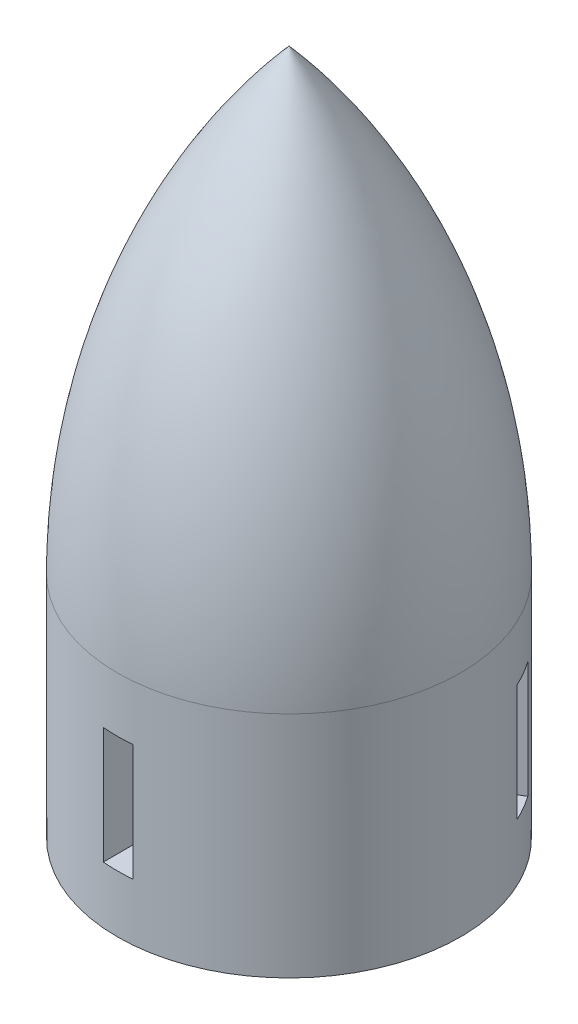
ISO-10303-21;
HEADER;
FILE_DESCRIPTION(('STEP AP214'),'2;1');
FILE_NAME('part.step','',(''),(''),'','','');
FILE_SCHEMA(('AUTOMOTIVE_DESIGN { 1 0 10303 214 1 1 1 1 }'));
ENDSEC;
DATA;
#1=APPLICATION_CONTEXT('core data for automotive mechanical design processes');
#2=APPLICATION_PROTOCOL_DEFINITION('international standard','automotive_design',2000,#1);
#3=PRODUCT_CONTEXT('',#1,'mechanical');
#4=PRODUCT('Part','Part','',(#3));
#5=PRODUCT_RELATED_PRODUCT_CATEGORY('part','',(#4));
#6=PRODUCT_DEFINITION_FORMATION('','',#4);
#7=PRODUCT_DEFINITION_CONTEXT('part definition',#1,'design');
#8=PRODUCT_DEFINITION('design','',#6,#7);
#9=PRODUCT_DEFINITION_SHAPE('','',#8);
#10=(LENGTH_UNIT() NAMED_UNIT(*) SI_UNIT(.MILLI.,.METRE.));
#11=(NAMED_UNIT(*) PLANE_ANGLE_UNIT() SI_UNIT($,.RADIAN.));
#12=(NAMED_UNIT(*) SI_UNIT($,.STERADIAN.) SOLID_ANGLE_UNIT());
#13=UNCERTAINTY_MEASURE_WITH_UNIT(LENGTH_MEASURE(1.E-05),#10,'distance_accuracy_value','');
#14=(GEOMETRIC_REPRESENTATION_CONTEXT(3) GLOBAL_UNCERTAINTY_ASSIGNED_CONTEXT((#13)) GLOBAL_UNIT_ASSIGNED_CONTEXT((#10,
#11,#12)) REPRESENTATION_CONTEXT('',''));
#15=CARTESIAN_POINT('',(0.,0.,0.));
#16=DIRECTION('',(0.,0.,1.));
#17=DIRECTION('',(1.,0.,0.));
#18=AXIS2_PLACEMENT_3D('',#15,#16,#17);
#19=CARTESIAN_POINT('',(0.,25.4,0.));
#20=DIRECTION('',(0.,-1.,0.));
#21=DIRECTION('',(0.,0.,-1.));
#22=AXIS2_PLACEMENT_3D('',#19,#20,#21);
#23=CYLINDRICAL_SURFACE('',#22,19.05);
#24=DIRECTION('',(0.,-1.,0.));
#25=VECTOR('',#24,1.);
#26=CARTESIAN_POINT('',(-17.2612088149553,25.4,-8.05935296698873));
#27=LINE('',#26,#25);
#28=CARTESIAN_POINT('',(-17.2612088149553,19.304,-8.05935296698873));
#29=VERTEX_POINT('',#28);
#30=CARTESIAN_POINT('',(-17.2612088149553,6.35,-8.05935296698873));
#31=VERTEX_POINT('',#30);
#32=EDGE_CURVE('E11',#29,#31,#27,.T.);
#33=ORIENTED_EDGE('',*,*,#32,.T.);
#34=CARTESIAN_POINT('',(0.,6.35,0.));
#35=DIRECTION('',(0.,-1.,0.));
#36=DIRECTION('',(0.,0.,-1.));
#37=AXIS2_PLACEMENT_3D('',#34,#35,#36);
#38=CIRCLE('',#37,19.05);
#39=CARTESIAN_POINT('',(-15.6102088149553,6.35,-10.9189688502849));
#40=VERTEX_POINT('',#39);
#41=EDGE_CURVE('E452',#31,#40,#38,.T.);
#42=ORIENTED_EDGE('',*,*,#41,.T.);
#43=DIRECTION('',(0.,-1.,0.));
#44=VECTOR('',#43,1.);
#45=CARTESIAN_POINT('',(-15.6102088149553,25.4,-10.9189688502849));
#46=LINE('',#45,#44);
#47=CARTESIAN_POINT('',(-15.6102088149553,19.304,-10.9189688502849));
#48=VERTEX_POINT('',#47);
#49=EDGE_CURVE('E40',#40,#48,#46,.F.);
#50=ORIENTED_EDGE('',*,*,#49,.T.);
#51=CARTESIAN_POINT('',(0.,19.304,0.));
#52=DIRECTION('',(0.,1.,0.));
#53=DIRECTION('',(0.,0.,1.));
#54=AXIS2_PLACEMENT_3D('',#51,#52,#53);
#55=CIRCLE('',#54,19.05);
#56=EDGE_CURVE('E454',#48,#29,#55,.T.);
#57=ORIENTED_EDGE('',*,*,#56,.T.);
#58=EDGE_LOOP('',(#33,#42,#50,#57));
#59=FACE_BOUND('',#58,.T.);
#60=DIRECTION('',(0.,-1.,0.));
#61=VECTOR('',#60,1.);
#62=CARTESIAN_POINT('',(15.6102088149554,25.4,-10.9189688502847));
#63=LINE('',#62,#61);
#64=CARTESIAN_POINT('',(15.6102088149554,19.304,-10.9189688502847));
#65=VERTEX_POINT('',#64);
#66=CARTESIAN_POINT('',(15.6102088149554,6.35,-10.9189688502847));
#67=VERTEX_POINT('',#66);
#68=EDGE_CURVE('E449',#65,#67,#63,.T.);
#69=ORIENTED_EDGE('',*,*,#68,.T.);
#70=CARTESIAN_POINT('',(0.,6.35,0.));
#71=DIRECTION('',(0.,-1.,0.));
#72=DIRECTION('',(0.,0.,-1.));
#73=AXIS2_PLACEMENT_3D('',#70,#71,#72);
#74=CIRCLE('',#73,19.05);
#75=CARTESIAN_POINT('',(17.2612088149554,6.35,-8.05935296698849));
#76=VERTEX_POINT('',#75);
#77=EDGE_CURVE('E440',#67,#76,#74,.T.);
#78=ORIENTED_EDGE('',*,*,#77,.T.);
#79=DIRECTION('',(0.,-1.,0.));
#80=VECTOR('',#79,1.);
#81=CARTESIAN_POINT('',(17.2612088149554,25.4,-8.05935296698849));
#82=LINE('',#81,#80);
#83=CARTESIAN_POINT('',(17.2612088149554,19.304,-8.05935296698849));
#84=VERTEX_POINT('',#83);
#85=EDGE_CURVE('E446',#76,#84,#82,.F.);
#86=ORIENTED_EDGE('',*,*,#85,.T.);
#87=CARTESIAN_POINT('',(0.,19.304,0.));
#88=DIRECTION('',(0.,1.,0.));
#89=DIRECTION('',(0.,0.,1.));
#90=AXIS2_PLACEMENT_3D('',#87,#88,#89);
#91=CIRCLE('',#90,19.05);
#92=EDGE_CURVE('E443',#84,#65,#91,.T.);
#93=ORIENTED_EDGE('',*,*,#92,.T.);
#94=EDGE_LOOP('',(#69,#78,#86,#93));
#95=FACE_BOUND('',#94,.T.);
#96=CARTESIAN_POINT('',(0.,19.304,0.));
#97=DIRECTION('',(0.,1.,0.));
#98=DIRECTION('',(0.,0.,1.));
#99=AXIS2_PLACEMENT_3D('',#96,#97,#98);
#100=CIRCLE('',#99,19.05);
#101=CARTESIAN_POINT('',(-1.651,19.304,18.9783218172735));
#102=VERTEX_POINT('',#101);
#103=CARTESIAN_POINT('',(1.651,19.304,18.9783218172735));
#104=VERTEX_POINT('',#103);
#105=EDGE_CURVE('E432',#102,#104,#100,.T.);
#106=ORIENTED_EDGE('',*,*,#105,.T.);
#107=DIRECTION('',(0.,-1.,0.));
#108=VECTOR('',#107,1.);
#109=CARTESIAN_POINT('',(1.651,25.4,18.9783218172735));
#110=LINE('',#109,#108);
#111=CARTESIAN_POINT('',(1.651,6.35,18.9783218172735));
#112=VERTEX_POINT('',#111);
#113=EDGE_CURVE('E437',#104,#112,#110,.T.);
#114=ORIENTED_EDGE('',*,*,#113,.T.);
#115=CARTESIAN_POINT('',(0.,6.35,0.));
#116=DIRECTION('',(0.,-1.,0.));
#117=DIRECTION('',(0.,0.,-1.));
#118=AXIS2_PLACEMENT_3D('',#115,#116,#117);
#119=CIRCLE('',#118,19.05);
#120=CARTESIAN_POINT('',(-1.651,6.35,18.9783218172735));
#121=VERTEX_POINT('',#120);
#122=EDGE_CURVE('E427',#112,#121,#119,.T.);
#123=ORIENTED_EDGE('',*,*,#122,.T.);
#124=DIRECTION('',(0.,-1.,0.));
#125=VECTOR('',#124,1.);
#126=CARTESIAN_POINT('',(-1.651,25.4,18.9783218172735));
#127=LINE('',#126,#125);
#128=EDGE_CURVE('E434',#121,#102,#127,.F.);
#129=ORIENTED_EDGE('',*,*,#128,.T.);
#130=EDGE_LOOP('',(#106,#114,#123,#129));
#131=FACE_BOUND('',#130,.T.);
#132=CARTESIAN_POINT('',(0.,25.4,0.));
#133=DIRECTION('',(0.,1.,0.));
#134=DIRECTION('',(0.,0.,1.));
#135=AXIS2_PLACEMENT_3D('',#132,#133,#134);
#136=CIRCLE('',#135,19.05);
#137=CARTESIAN_POINT('',(0.,25.4,19.05));
#138=VERTEX_POINT('',#137);
#139=EDGE_CURVE('E424',#138,#138,#136,.T.);
#140=ORIENTED_EDGE('',*,*,#139,.F.);
#141=EDGE_LOOP('',(#140));
#142=FACE_BOUND('',#141,.T.);
#143=CARTESIAN_POINT('',(0.,0.,0.));
#144=DIRECTION('',(0.,1.,0.));
#145=DIRECTION('',(0.,0.,1.));
#146=AXIS2_PLACEMENT_3D('',#143,#144,#145);
#147=CIRCLE('',#146,19.05);
#148=CARTESIAN_POINT('',(0.,0.,19.05));
#149=VERTEX_POINT('',#148);
#150=EDGE_CURVE('E393',#149,#149,#147,.T.);
#151=ORIENTED_EDGE('',*,*,#150,.T.);
#152=EDGE_LOOP('',(#151));
#153=FACE_BOUND('',#152,.T.);
#154=ADVANCED_FACE('F33',(#59,#95,#131,#142,#153),#23,.T.);
#155=CARTESIAN_POINT('',(0.,0.,0.));
#156=DIRECTION('',(0.,1.,0.));
#157=DIRECTION('',(0.,0.,1.));
#158=AXIS2_PLACEMENT_3D('',#155,#156,#157);
#159=PLANE('',#158);
#160=DIRECTION('',(-1.,0.,0.));
#161=VECTOR('',#160,1.);
#162=CARTESIAN_POINT('',(-3.683,0.,1.27));
#163=LINE('',#162,#161);
#164=CARTESIAN_POINT('',(-1.9628922035849,0.,1.27));
#165=VERTEX_POINT('',#164);
#166=CARTESIAN_POINT('',(-3.683,0.,1.27));
#167=VERTEX_POINT('',#166);
#168=EDGE_CURVE('E347',#165,#167,#163,.T.);
#169=ORIENTED_EDGE('',*,*,#168,.F.);
#170=DIRECTION('',(-0.707106781186549,0.,-0.707106781186546));
#171=VECTOR('',#170,1.);
#172=CARTESIAN_POINT('',(-1.9628922035849,0.,1.27));
#173=LINE('',#172,#171);
#174=CARTESIAN_POINT('',(-1.27,0.,1.9628922035849));
#175=VERTEX_POINT('',#174);
#176=EDGE_CURVE('E288',#175,#165,#173,.T.);
#177=ORIENTED_EDGE('',*,*,#176,.F.);
#178=DIRECTION('',(0.,0.,-1.));
#179=VECTOR('',#178,1.);
#180=CARTESIAN_POINT('',(-1.27,0.,1.9628922035849));
#181=LINE('',#180,#179);
#182=CARTESIAN_POINT('',(-1.27,0.,3.683));
#183=VERTEX_POINT('',#182);
#184=EDGE_CURVE('E300',#183,#175,#181,.T.);
#185=ORIENTED_EDGE('',*,*,#184,.F.);
#186=DIRECTION('',(-1.,0.,0.));
#187=VECTOR('',#186,1.);
#188=CARTESIAN_POINT('',(-1.27,0.,3.683));
#189=LINE('',#188,#187);
#190=CARTESIAN_POINT('',(1.27,0.,3.683));
#191=VERTEX_POINT('',#190);
#192=EDGE_CURVE('E386',#191,#183,#189,.T.);
#193=ORIENTED_EDGE('',*,*,#192,.F.);
#194=DIRECTION('',(0.,0.,1.));
#195=VECTOR('',#194,1.);
#196=CARTESIAN_POINT('',(1.27,0.,3.683));
#197=LINE('',#196,#195);
#198=CARTESIAN_POINT('',(1.27,0.,1.9628922035849));
#199=VERTEX_POINT('',#198);
#200=EDGE_CURVE('E383',#199,#191,#197,.T.);
#201=ORIENTED_EDGE('',*,*,#200,.F.);
#202=DIRECTION('',(-0.707106781186547,0.,0.707106781186548));
#203=VECTOR('',#202,1.);
#204=CARTESIAN_POINT('',(1.27,0.,1.9628922035849));
#205=LINE('',#204,#203);
#206=CARTESIAN_POINT('',(1.96289220358489,0.,1.27));
#207=VERTEX_POINT('',#206);
#208=EDGE_CURVE('E380',#207,#199,#205,.T.);
#209=ORIENTED_EDGE('',*,*,#208,.F.);
#210=DIRECTION('',(-1.,0.,0.));
#211=VECTOR('',#210,1.);
#212=CARTESIAN_POINT('',(1.96289220358489,0.,1.27));
#213=LINE('',#212,#211);
#214=CARTESIAN_POINT('',(3.683,0.,1.27));
#215=VERTEX_POINT('',#214);
#216=EDGE_CURVE('E377',#215,#207,#213,.T.);
#217=ORIENTED_EDGE('',*,*,#216,.F.);
#218=DIRECTION('',(0.,0.,1.));
#219=VECTOR('',#218,1.);
#220=CARTESIAN_POINT('',(3.683,0.,1.27));
#221=LINE('',#220,#219);
#222=CARTESIAN_POINT('',(3.683,0.,-1.27));
#223=VERTEX_POINT('',#222);
#224=EDGE_CURVE('E374',#223,#215,#221,.T.);
#225=ORIENTED_EDGE('',*,*,#224,.F.);
#226=DIRECTION('',(1.,0.,0.));
#227=VECTOR('',#226,1.);
#228=CARTESIAN_POINT('',(3.683,0.,-1.27));
#229=LINE('',#228,#227);
#230=CARTESIAN_POINT('',(1.9628922035849,0.,-1.27));
#231=VERTEX_POINT('',#230);
#232=EDGE_CURVE('E371',#231,#223,#229,.T.);
#233=ORIENTED_EDGE('',*,*,#232,.F.);
#234=DIRECTION('',(0.707106781186548,0.,0.707106781186547));
#235=VECTOR('',#234,1.);
#236=CARTESIAN_POINT('',(1.9628922035849,0.,-1.27));
#237=LINE('',#236,#235);
#238=CARTESIAN_POINT('',(1.27,0.,-1.9628922035849));
#239=VERTEX_POINT('',#238);
#240=EDGE_CURVE('E368',#239,#231,#237,.T.);
#241=ORIENTED_EDGE('',*,*,#240,.F.);
#242=DIRECTION('',(0.,0.,1.));
#243=VECTOR('',#242,1.);
#244=CARTESIAN_POINT('',(1.27,0.,-1.9628922035849));
#245=LINE('',#244,#243);
#246=CARTESIAN_POINT('',(1.27,0.,-3.683));
#247=VERTEX_POINT('',#246);
#248=EDGE_CURVE('E365',#247,#239,#245,.T.);
#249=ORIENTED_EDGE('',*,*,#248,.F.);
#250=DIRECTION('',(1.,0.,0.));
#251=VECTOR('',#250,1.);
#252=CARTESIAN_POINT('',(1.27,0.,-3.683));
#253=LINE('',#252,#251);
#254=CARTESIAN_POINT('',(-1.27,0.,-3.683));
#255=VERTEX_POINT('',#254);
#256=EDGE_CURVE('E362',#255,#247,#253,.T.);
#257=ORIENTED_EDGE('',*,*,#256,.F.);
#258=DIRECTION('',(0.,0.,-1.));
#259=VECTOR('',#258,1.);
#260=CARTESIAN_POINT('',(-1.27,0.,-3.683));
#261=LINE('',#260,#259);
#262=CARTESIAN_POINT('',(-1.27,0.,-1.9628922035849));
#263=VERTEX_POINT('',#262);
#264=EDGE_CURVE('E359',#263,#255,#261,.T.);
#265=ORIENTED_EDGE('',*,*,#264,.F.);
#266=DIRECTION('',(0.707106781186548,0.,-0.707106781186547));
#267=VECTOR('',#266,1.);
#268=CARTESIAN_POINT('',(-1.27,0.,-1.9628922035849));
#269=LINE('',#268,#267);
#270=CARTESIAN_POINT('',(-1.9628922035849,0.,-1.27));
#271=VERTEX_POINT('',#270);
#272=EDGE_CURVE('E356',#271,#263,#269,.T.);
#273=ORIENTED_EDGE('',*,*,#272,.F.);
#274=DIRECTION('',(1.,0.,0.));
#275=VECTOR('',#274,1.);
#276=CARTESIAN_POINT('',(-1.9628922035849,0.,-1.27));
#277=LINE('',#276,#275);
#278=CARTESIAN_POINT('',(-3.683,0.,-1.27));
#279=VERTEX_POINT('',#278);
#280=EDGE_CURVE('E353',#279,#271,#277,.T.);
#281=ORIENTED_EDGE('',*,*,#280,.F.);
#282=DIRECTION('',(0.,0.,-1.));
#283=VECTOR('',#282,1.);
#284=CARTESIAN_POINT('',(-3.683,0.,-1.27));
#285=LINE('',#284,#283);
#286=EDGE_CURVE('E350',#167,#279,#285,.T.);
#287=ORIENTED_EDGE('',*,*,#286,.F.);
#288=EDGE_LOOP('',(#169,#177,#185,#193,#201,#209,#217,#225,#233,#241,#249,#257,#265,#273,#281,#287));
#289=FACE_BOUND('',#288,.T.);
#290=ORIENTED_EDGE('',*,*,#150,.F.);
#291=EDGE_LOOP('',(#290));
#292=FACE_BOUND('',#291,.T.);
#293=ADVANCED_FACE('F473',(#289,#292),#159,.F.);
#294=CARTESIAN_POINT('',(-1.9628922035849,12.7,1.27));
#295=DIRECTION('',(-0.707106781186546,0.,0.707106781186549));
#296=DIRECTION('',(0.707106781186549,0.,0.707106781186546));
#297=AXIS2_PLACEMENT_3D('',#294,#295,#296);
#298=PLANE('',#297);
#299=ORIENTED_EDGE('',*,*,#176,.T.);
#300=DIRECTION('',(0.,-1.,0.));
#301=VECTOR('',#300,1.);
#302=CARTESIAN_POINT('',(-1.9628922035849,12.7,1.27));
#303=LINE('',#302,#301);
#304=CARTESIAN_POINT('',(-1.9628922035849,12.7,1.27));
#305=VERTEX_POINT('',#304);
#306=EDGE_CURVE('E345',#305,#165,#303,.T.);
#307=ORIENTED_EDGE('',*,*,#306,.F.);
#308=DIRECTION('',(-0.707106781186549,0.,-0.707106781186546));
#309=VECTOR('',#308,1.);
#310=CARTESIAN_POINT('',(-1.9628922035849,12.7,1.27));
#311=LINE('',#310,#309);
#312=CARTESIAN_POINT('',(-1.27,12.7,1.9628922035849));
#313=VERTEX_POINT('',#312);
#314=EDGE_CURVE('E296',#313,#305,#311,.T.);
#315=ORIENTED_EDGE('',*,*,#314,.F.);
#316=DIRECTION('',(0.,-1.,0.));
#317=VECTOR('',#316,1.);
#318=CARTESIAN_POINT('',(-1.27,12.7,1.9628922035849));
#319=LINE('',#318,#317);
#320=EDGE_CURVE('E391',#313,#175,#319,.T.);
#321=ORIENTED_EDGE('',*,*,#320,.T.);
#322=EDGE_LOOP('',(#299,#307,#315,#321));
#323=FACE_BOUND('',#322,.T.);
#324=ADVANCED_FACE('F477',(#323),#298,.F.);
#325=CARTESIAN_POINT('',(-1.27,12.7,1.9628922035849));
#326=DIRECTION('',(-1.,0.,0.));
#327=DIRECTION('',(0.,0.,1.));
#328=AXIS2_PLACEMENT_3D('',#325,#326,#327);
#329=PLANE('',#328);
#330=ORIENTED_EDGE('',*,*,#184,.T.);
#331=ORIENTED_EDGE('',*,*,#320,.F.);
#332=DIRECTION('',(0.,0.,-1.));
#333=VECTOR('',#332,1.);
#334=CARTESIAN_POINT('',(-1.27,12.7,1.9628922035849));
#335=LINE('',#334,#333);
#336=CARTESIAN_POINT('',(-1.27,12.7,3.683));
#337=VERTEX_POINT('',#336);
#338=EDGE_CURVE('E342',#337,#313,#335,.T.);
#339=ORIENTED_EDGE('',*,*,#338,.F.);
#340=DIRECTION('',(0.,-1.,0.));
#341=VECTOR('',#340,1.);
#342=CARTESIAN_POINT('',(-1.27,12.7,3.683));
#343=LINE('',#342,#341);
#344=EDGE_CURVE('E394',#337,#183,#343,.T.);
#345=ORIENTED_EDGE('',*,*,#344,.T.);
#346=EDGE_LOOP('',(#330,#331,#339,#345));
#347=FACE_BOUND('',#346,.T.);
#348=ADVANCED_FACE('F482',(#347),#329,.F.);
#349=CARTESIAN_POINT('',(-1.27,12.7,3.683));
#350=DIRECTION('',(0.,0.,1.));
#351=DIRECTION('',(1.,0.,0.));
#352=AXIS2_PLACEMENT_3D('',#349,#350,#351);
#353=PLANE('',#352);
#354=ORIENTED_EDGE('',*,*,#192,.T.);
#355=ORIENTED_EDGE('',*,*,#344,.F.);
#356=DIRECTION('',(-1.,0.,0.));
#357=VECTOR('',#356,1.);
#358=CARTESIAN_POINT('',(-1.27,12.7,3.683));
#359=LINE('',#358,#357);
#360=CARTESIAN_POINT('',(1.27,12.7,3.683));
#361=VERTEX_POINT('',#360);
#362=EDGE_CURVE('E339',#361,#337,#359,.T.);
#363=ORIENTED_EDGE('',*,*,#362,.F.);
#364=DIRECTION('',(0.,-1.,0.));
#365=VECTOR('',#364,1.);
#366=CARTESIAN_POINT('',(1.27,12.7,3.683));
#367=LINE('',#366,#365);
#368=EDGE_CURVE('E396',#361,#191,#367,.T.);
#369=ORIENTED_EDGE('',*,*,#368,.T.);
#370=EDGE_LOOP('',(#354,#355,#363,#369));
#371=FACE_BOUND('',#370,.T.);
#372=ADVANCED_FACE('F540',(#371),#353,.F.);
#373=CARTESIAN_POINT('',(1.27,12.7,3.683));
#374=DIRECTION('',(1.,0.,0.));
#375=DIRECTION('',(0.,0.,-1.));
#376=AXIS2_PLACEMENT_3D('',#373,#374,#375);
#377=PLANE('',#376);
#378=ORIENTED_EDGE('',*,*,#200,.T.);
#379=ORIENTED_EDGE('',*,*,#368,.F.);
#380=DIRECTION('',(0.,0.,1.));
#381=VECTOR('',#380,1.);
#382=CARTESIAN_POINT('',(1.27,12.7,3.683));
#383=LINE('',#382,#381);
#384=CARTESIAN_POINT('',(1.27,12.7,1.9628922035849));
#385=VERTEX_POINT('',#384);
#386=EDGE_CURVE('E336',#385,#361,#383,.T.);
#387=ORIENTED_EDGE('',*,*,#386,.F.);
#388=DIRECTION('',(0.,-1.,0.));
#389=VECTOR('',#388,1.);
#390=CARTESIAN_POINT('',(1.27,12.7,1.9628922035849));
#391=LINE('',#390,#389);
#392=EDGE_CURVE('E398',#385,#199,#391,.T.);
#393=ORIENTED_EDGE('',*,*,#392,.T.);
#394=EDGE_LOOP('',(#378,#379,#387,#393));
#395=FACE_BOUND('',#394,.T.);
#396=ADVANCED_FACE('F536',(#395),#377,.F.);
#397=CARTESIAN_POINT('',(1.27,12.7,1.9628922035849));
#398=DIRECTION('',(0.707106781186548,0.,0.707106781186547));
#399=DIRECTION('',(0.707106781186547,0.,-0.707106781186548));
#400=AXIS2_PLACEMENT_3D('',#397,#398,#399);
#401=PLANE('',#400);
#402=ORIENTED_EDGE('',*,*,#208,.T.);
#403=ORIENTED_EDGE('',*,*,#392,.F.);
#404=DIRECTION('',(-0.707106781186547,0.,0.707106781186548));
#405=VECTOR('',#404,1.);
#406=CARTESIAN_POINT('',(1.27,12.7,1.9628922035849));
#407=LINE('',#406,#405);
#408=CARTESIAN_POINT('',(1.96289220358489,12.7,1.27));
#409=VERTEX_POINT('',#408);
#410=EDGE_CURVE('E333',#409,#385,#407,.T.);
#411=ORIENTED_EDGE('',*,*,#410,.F.);
#412=DIRECTION('',(0.,-1.,0.));
#413=VECTOR('',#412,1.);
#414=CARTESIAN_POINT('',(1.96289220358489,12.7,1.27));
#415=LINE('',#414,#413);
#416=EDGE_CURVE('E400',#409,#207,#415,.T.);
#417=ORIENTED_EDGE('',*,*,#416,.T.);
#418=EDGE_LOOP('',(#402,#403,#411,#417));
#419=FACE_BOUND('',#418,.T.);
#420=ADVANCED_FACE('F532',(#419),#401,.F.);
#421=CARTESIAN_POINT('',(1.96289220358489,12.7,1.27));
#422=DIRECTION('',(0.,0.,1.));
#423=DIRECTION('',(1.,0.,0.));
#424=AXIS2_PLACEMENT_3D('',#421,#422,#423);
#425=PLANE('',#424);
#426=ORIENTED_EDGE('',*,*,#216,.T.);
#427=ORIENTED_EDGE('',*,*,#416,.F.);
#428=DIRECTION('',(-1.,0.,0.));
#429=VECTOR('',#428,1.);
#430=CARTESIAN_POINT('',(1.96289220358489,12.7,1.27));
#431=LINE('',#430,#429);
#432=CARTESIAN_POINT('',(3.683,12.7,1.27));
#433=VERTEX_POINT('',#432);
#434=EDGE_CURVE('E330',#433,#409,#431,.T.);
#435=ORIENTED_EDGE('',*,*,#434,.F.);
#436=DIRECTION('',(0.,-1.,0.));
#437=VECTOR('',#436,1.);
#438=CARTESIAN_POINT('',(3.683,12.7,1.27));
#439=LINE('',#438,#437);
#440=EDGE_CURVE('E402',#433,#215,#439,.T.);
#441=ORIENTED_EDGE('',*,*,#440,.T.);
#442=EDGE_LOOP('',(#426,#427,#435,#441));
#443=FACE_BOUND('',#442,.T.);
#444=ADVANCED_FACE('F528',(#443),#425,.F.);
#445=CARTESIAN_POINT('',(3.683,12.7,1.27));
#446=DIRECTION('',(1.,0.,0.));
#447=DIRECTION('',(0.,0.,-1.));
#448=AXIS2_PLACEMENT_3D('',#445,#446,#447);
#449=PLANE('',#448);
#450=ORIENTED_EDGE('',*,*,#224,.T.);
#451=ORIENTED_EDGE('',*,*,#440,.F.);
#452=DIRECTION('',(0.,0.,1.));
#453=VECTOR('',#452,1.);
#454=CARTESIAN_POINT('',(3.683,12.7,1.27));
#455=LINE('',#454,#453);
#456=CARTESIAN_POINT('',(3.683,12.7,-1.27));
#457=VERTEX_POINT('',#456);
#458=EDGE_CURVE('E327',#457,#433,#455,.T.);
#459=ORIENTED_EDGE('',*,*,#458,.F.);
#460=DIRECTION('',(0.,-1.,0.));
#461=VECTOR('',#460,1.);
#462=CARTESIAN_POINT('',(3.683,12.7,-1.27));
#463=LINE('',#462,#461);
#464=EDGE_CURVE('E404',#457,#223,#463,.T.);
#465=ORIENTED_EDGE('',*,*,#464,.T.);
#466=EDGE_LOOP('',(#450,#451,#459,#465));
#467=FACE_BOUND('',#466,.T.);
#468=ADVANCED_FACE('F524',(#467),#449,.F.);
#469=CARTESIAN_POINT('',(3.683,12.7,-1.27));
#470=DIRECTION('',(0.,0.,-1.));
#471=DIRECTION('',(-1.,0.,0.));
#472=AXIS2_PLACEMENT_3D('',#469,#470,#471);
#473=PLANE('',#472);
#474=ORIENTED_EDGE('',*,*,#232,.T.);
#475=ORIENTED_EDGE('',*,*,#464,.F.);
#476=DIRECTION('',(1.,0.,0.));
#477=VECTOR('',#476,1.);
#478=CARTESIAN_POINT('',(3.683,12.7,-1.27));
#479=LINE('',#478,#477);
#480=CARTESIAN_POINT('',(1.9628922035849,12.7,-1.27));
#481=VERTEX_POINT('',#480);
#482=EDGE_CURVE('E324',#481,#457,#479,.T.);
#483=ORIENTED_EDGE('',*,*,#482,.F.);
#484=DIRECTION('',(0.,-1.,0.));
#485=VECTOR('',#484,1.);
#486=CARTESIAN_POINT('',(1.9628922035849,12.7,-1.27));
#487=LINE('',#486,#485);
#488=EDGE_CURVE('E406',#481,#231,#487,.T.);
#489=ORIENTED_EDGE('',*,*,#488,.T.);
#490=EDGE_LOOP('',(#474,#475,#483,#489));
#491=FACE_BOUND('',#490,.T.);
#492=ADVANCED_FACE('F520',(#491),#473,.F.);
#493=CARTESIAN_POINT('',(1.9628922035849,12.7,-1.27));
#494=DIRECTION('',(0.707106781186547,0.,-0.707106781186548));
#495=DIRECTION('',(-0.707106781186548,0.,-0.707106781186547));
#496=AXIS2_PLACEMENT_3D('',#493,#494,#495);
#497=PLANE('',#496);
#498=ORIENTED_EDGE('',*,*,#240,.T.);
#499=ORIENTED_EDGE('',*,*,#488,.F.);
#500=DIRECTION('',(0.707106781186548,0.,0.707106781186547));
#501=VECTOR('',#500,1.);
#502=CARTESIAN_POINT('',(1.9628922035849,12.7,-1.27));
#503=LINE('',#502,#501);
#504=CARTESIAN_POINT('',(1.27,12.7,-1.9628922035849));
#505=VERTEX_POINT('',#504);
#506=EDGE_CURVE('E321',#505,#481,#503,.T.);
#507=ORIENTED_EDGE('',*,*,#506,.F.);
#508=DIRECTION('',(0.,-1.,0.));
#509=VECTOR('',#508,1.);
#510=CARTESIAN_POINT('',(1.27,12.7,-1.9628922035849));
#511=LINE('',#510,#509);
#512=EDGE_CURVE('E408',#505,#239,#511,.T.);
#513=ORIENTED_EDGE('',*,*,#512,.T.);
#514=EDGE_LOOP('',(#498,#499,#507,#513));
#515=FACE_BOUND('',#514,.T.);
#516=ADVANCED_FACE('F516',(#515),#497,.F.);
#517=CARTESIAN_POINT('',(1.27,12.7,-1.9628922035849));
#518=DIRECTION('',(1.,0.,0.));
#519=DIRECTION('',(0.,0.,-1.));
#520=AXIS2_PLACEMENT_3D('',#517,#518,#519);
#521=PLANE('',#520);
#522=ORIENTED_EDGE('',*,*,#248,.T.);
#523=ORIENTED_EDGE('',*,*,#512,.F.);
#524=DIRECTION('',(0.,0.,1.));
#525=VECTOR('',#524,1.);
#526=CARTESIAN_POINT('',(1.27,12.7,-1.9628922035849));
#527=LINE('',#526,#525);
#528=CARTESIAN_POINT('',(1.27,12.7,-3.683));
#529=VERTEX_POINT('',#528);
#530=EDGE_CURVE('E318',#529,#505,#527,.T.);
#531=ORIENTED_EDGE('',*,*,#530,.F.);
#532=DIRECTION('',(0.,-1.,0.));
#533=VECTOR('',#532,1.);
#534=CARTESIAN_POINT('',(1.27,12.7,-3.683));
#535=LINE('',#534,#533);
#536=EDGE_CURVE('E410',#529,#247,#535,.T.);
#537=ORIENTED_EDGE('',*,*,#536,.T.);
#538=EDGE_LOOP('',(#522,#523,#531,#537));
#539=FACE_BOUND('',#538,.T.);
#540=ADVANCED_FACE('F512',(#539),#521,.F.);
#541=CARTESIAN_POINT('',(1.27,12.7,-3.683));
#542=DIRECTION('',(0.,0.,-1.));
#543=DIRECTION('',(-1.,0.,0.));
#544=AXIS2_PLACEMENT_3D('',#541,#542,#543);
#545=PLANE('',#544);
#546=ORIENTED_EDGE('',*,*,#256,.T.);
#547=ORIENTED_EDGE('',*,*,#536,.F.);
#548=DIRECTION('',(1.,0.,0.));
#549=VECTOR('',#548,1.);
#550=CARTESIAN_POINT('',(1.27,12.7,-3.683));
#551=LINE('',#550,#549);
#552=CARTESIAN_POINT('',(-1.27,12.7,-3.683));
#553=VERTEX_POINT('',#552);
#554=EDGE_CURVE('E315',#553,#529,#551,.T.);
#555=ORIENTED_EDGE('',*,*,#554,.F.);
#556=DIRECTION('',(0.,-1.,0.));
#557=VECTOR('',#556,1.);
#558=CARTESIAN_POINT('',(-1.27,12.7,-3.683));
#559=LINE('',#558,#557);
#560=EDGE_CURVE('E412',#553,#255,#559,.T.);
#561=ORIENTED_EDGE('',*,*,#560,.T.);
#562=EDGE_LOOP('',(#546,#547,#555,#561));
#563=FACE_BOUND('',#562,.T.);
#564=ADVANCED_FACE('F508',(#563),#545,.F.);
#565=CARTESIAN_POINT('',(-1.27,12.7,-3.683));
#566=DIRECTION('',(-1.,0.,0.));
#567=DIRECTION('',(0.,0.,1.));
#568=AXIS2_PLACEMENT_3D('',#565,#566,#567);
#569=PLANE('',#568);
#570=ORIENTED_EDGE('',*,*,#264,.T.);
#571=ORIENTED_EDGE('',*,*,#560,.F.);
#572=DIRECTION('',(0.,0.,-1.));
#573=VECTOR('',#572,1.);
#574=CARTESIAN_POINT('',(-1.27,12.7,-3.683));
#575=LINE('',#574,#573);
#576=CARTESIAN_POINT('',(-1.27,12.7,-1.9628922035849));
#577=VERTEX_POINT('',#576);
#578=EDGE_CURVE('E312',#577,#553,#575,.T.);
#579=ORIENTED_EDGE('',*,*,#578,.F.);
#580=DIRECTION('',(0.,-1.,0.));
#581=VECTOR('',#580,1.);
#582=CARTESIAN_POINT('',(-1.27,12.7,-1.9628922035849));
#583=LINE('',#582,#581);
#584=EDGE_CURVE('E414',#577,#263,#583,.T.);
#585=ORIENTED_EDGE('',*,*,#584,.T.);
#586=EDGE_LOOP('',(#570,#571,#579,#585));
#587=FACE_BOUND('',#586,.T.);
#588=ADVANCED_FACE('F504',(#587),#569,.F.);
#589=CARTESIAN_POINT('',(-1.27,12.7,-1.9628922035849));
#590=DIRECTION('',(-0.707106781186547,0.,-0.707106781186548));
#591=DIRECTION('',(-0.707106781186548,0.,0.707106781186547));
#592=AXIS2_PLACEMENT_3D('',#589,#590,#591);
#593=PLANE('',#592);
#594=ORIENTED_EDGE('',*,*,#272,.T.);
#595=ORIENTED_EDGE('',*,*,#584,.F.);
#596=DIRECTION('',(0.707106781186548,0.,-0.707106781186547));
#597=VECTOR('',#596,1.);
#598=CARTESIAN_POINT('',(-1.27,12.7,-1.9628922035849));
#599=LINE('',#598,#597);
#600=CARTESIAN_POINT('',(-1.9628922035849,12.7,-1.27));
#601=VERTEX_POINT('',#600);
#602=EDGE_CURVE('E309',#601,#577,#599,.T.);
#603=ORIENTED_EDGE('',*,*,#602,.F.);
#604=DIRECTION('',(0.,-1.,0.));
#605=VECTOR('',#604,1.);
#606=CARTESIAN_POINT('',(-1.9628922035849,12.7,-1.27));
#607=LINE('',#606,#605);
#608=EDGE_CURVE('E416',#601,#271,#607,.T.);
#609=ORIENTED_EDGE('',*,*,#608,.T.);
#610=EDGE_LOOP('',(#594,#595,#603,#609));
#611=FACE_BOUND('',#610,.T.);
#612=ADVANCED_FACE('F500',(#611),#593,.F.);
#613=CARTESIAN_POINT('',(-1.9628922035849,12.7,-1.27));
#614=DIRECTION('',(0.,0.,-1.));
#615=DIRECTION('',(-1.,0.,0.));
#616=AXIS2_PLACEMENT_3D('',#613,#614,#615);
#617=PLANE('',#616);
#618=ORIENTED_EDGE('',*,*,#280,.T.);
#619=ORIENTED_EDGE('',*,*,#608,.F.);
#620=DIRECTION('',(1.,0.,0.));
#621=VECTOR('',#620,1.);
#622=CARTESIAN_POINT('',(-1.9628922035849,12.7,-1.27));
#623=LINE('',#622,#621);
#624=CARTESIAN_POINT('',(-3.683,12.7,-1.27));
#625=VERTEX_POINT('',#624);
#626=EDGE_CURVE('E306',#625,#601,#623,.T.);
#627=ORIENTED_EDGE('',*,*,#626,.F.);
#628=DIRECTION('',(0.,-1.,0.));
#629=VECTOR('',#628,1.);
#630=CARTESIAN_POINT('',(-3.683,12.7,-1.27));
#631=LINE('',#630,#629);
#632=EDGE_CURVE('E418',#625,#279,#631,.T.);
#633=ORIENTED_EDGE('',*,*,#632,.T.);
#634=EDGE_LOOP('',(#618,#619,#627,#633));
#635=FACE_BOUND('',#634,.T.);
#636=ADVANCED_FACE('F496',(#635),#617,.F.);
#637=CARTESIAN_POINT('',(-3.683,12.7,-1.27));
#638=DIRECTION('',(-1.,0.,0.));
#639=DIRECTION('',(0.,0.,1.));
#640=AXIS2_PLACEMENT_3D('',#637,#638,#639);
#641=PLANE('',#640);
#642=ORIENTED_EDGE('',*,*,#286,.T.);
#643=ORIENTED_EDGE('',*,*,#632,.F.);
#644=DIRECTION('',(0.,0.,-1.));
#645=VECTOR('',#644,1.);
#646=CARTESIAN_POINT('',(-3.683,12.7,-1.27));
#647=LINE('',#646,#645);
#648=CARTESIAN_POINT('',(-3.683,12.7,1.27));
#649=VERTEX_POINT('',#648);
#650=EDGE_CURVE('E303',#649,#625,#647,.T.);
#651=ORIENTED_EDGE('',*,*,#650,.F.);
#652=DIRECTION('',(0.,-1.,0.));
#653=VECTOR('',#652,1.);
#654=CARTESIAN_POINT('',(-3.683,12.7,1.27));
#655=LINE('',#654,#653);
#656=EDGE_CURVE('E420',#649,#167,#655,.T.);
#657=ORIENTED_EDGE('',*,*,#656,.T.);
#658=EDGE_LOOP('',(#642,#643,#651,#657));
#659=FACE_BOUND('',#658,.T.);
#660=ADVANCED_FACE('F492',(#659),#641,.F.);
#661=CARTESIAN_POINT('',(-3.683,12.7,1.27));
#662=DIRECTION('',(0.,0.,1.));
#663=DIRECTION('',(1.,0.,0.));
#664=AXIS2_PLACEMENT_3D('',#661,#662,#663);
#665=PLANE('',#664);
#666=ORIENTED_EDGE('',*,*,#168,.T.);
#667=ORIENTED_EDGE('',*,*,#656,.F.);
#668=DIRECTION('',(-1.,0.,0.));
#669=VECTOR('',#668,1.);
#670=CARTESIAN_POINT('',(-3.683,12.7,1.27));
#671=LINE('',#670,#669);
#672=EDGE_CURVE('E299',#305,#649,#671,.T.);
#673=ORIENTED_EDGE('',*,*,#672,.F.);
#674=ORIENTED_EDGE('',*,*,#306,.T.);
#675=EDGE_LOOP('',(#666,#667,#673,#674));
#676=FACE_BOUND('',#675,.T.);
#677=ADVANCED_FACE('F488',(#676),#665,.F.);
#678=CARTESIAN_POINT('',(0.,12.7,0.));
#679=DIRECTION('',(0.,1.,0.));
#680=DIRECTION('',(0.,0.,1.));
#681=AXIS2_PLACEMENT_3D('',#678,#679,#680);
#682=PLANE('',#681);
#683=ORIENTED_EDGE('',*,*,#314,.T.);
#684=ORIENTED_EDGE('',*,*,#672,.T.);
#685=ORIENTED_EDGE('',*,*,#650,.T.);
#686=ORIENTED_EDGE('',*,*,#626,.T.);
#687=ORIENTED_EDGE('',*,*,#602,.T.);
#688=ORIENTED_EDGE('',*,*,#578,.T.);
#689=ORIENTED_EDGE('',*,*,#554,.T.);
#690=ORIENTED_EDGE('',*,*,#530,.T.);
#691=ORIENTED_EDGE('',*,*,#506,.T.);
#692=ORIENTED_EDGE('',*,*,#482,.T.);
#693=ORIENTED_EDGE('',*,*,#458,.T.);
#694=ORIENTED_EDGE('',*,*,#434,.T.);
#695=ORIENTED_EDGE('',*,*,#410,.T.);
#696=ORIENTED_EDGE('',*,*,#386,.T.);
#697=ORIENTED_EDGE('',*,*,#362,.T.);
#698=ORIENTED_EDGE('',*,*,#338,.T.);
#699=EDGE_LOOP('',(#683,#684,#685,#686,#687,#688,#689,#690,#691,#692,#693,#694,#695,#696,#697,#698));
#700=FACE_BOUND('',#699,.T.);
#701=ADVANCED_FACE('F491',(#700),#682,.F.);
#702=CARTESIAN_POINT('',(58.2083333333334,25.4,0.));
#703=DIRECTION('',(0.,0.,-1.));
#704=DIRECTION('',(-1.,0.,0.));
#705=AXIS2_PLACEMENT_3D('',#702,#703,#704);
#706=CIRCLE('',#705,77.2583333333334);
#707=TRIMMED_CURVE('',#706,(PARAMETER_VALUE(-0.717541340541144)),
(PARAMETER_VALUE(0.717541340541144)),.T.,.PARAMETER.);
#708=CARTESIAN_POINT('',(0.,25.4,0.));
#709=DIRECTION('',(0.,1.,0.));
#710=AXIS1_PLACEMENT('',#708,#709);
#711=SURFACE_OF_REVOLUTION('',#707,#710);
#712=CARTESIAN_POINT('',(0.,76.2,0.));
#713=VERTEX_POINT('',#712);
#714=VERTEX_LOOP('',#713);
#715=FACE_BOUND('',#714,.T.);
#716=ORIENTED_EDGE('',*,*,#139,.T.);
#717=EDGE_LOOP('',(#716));
#718=FACE_BOUND('',#717,.T.);
#719=ADVANCED_FACE('F550',(#715,#718),#711,.T.);
#720=CARTESIAN_POINT('',(-1.651,19.304,12.7));
#721=DIRECTION('',(-1.,0.,0.));
#722=DIRECTION('',(0.,-1.,0.));
#723=AXIS2_PLACEMENT_3D('',#720,#721,#722);
#724=PLANE('',#723);
#725=DIRECTION('',(0.,0.,1.));
#726=VECTOR('',#725,1.);
#727=CARTESIAN_POINT('',(-1.651,6.35,12.7));
#728=LINE('',#727,#726);
#729=CARTESIAN_POINT('',(-1.651,6.35,12.7));
#730=VERTEX_POINT('',#729);
#731=EDGE_CURVE('E284',#730,#121,#728,.T.);
#732=ORIENTED_EDGE('',*,*,#731,.F.);
#733=DIRECTION('',(0.,-1.,0.));
#734=VECTOR('',#733,1.);
#735=CARTESIAN_POINT('',(-1.651,19.304,12.7));
#736=LINE('',#735,#734);
#737=CARTESIAN_POINT('',(-1.651,19.304,12.7));
#738=VERTEX_POINT('',#737);
#739=EDGE_CURVE('E250',#738,#730,#736,.T.);
#740=ORIENTED_EDGE('',*,*,#739,.F.);
#741=DIRECTION('',(0.,0.,1.));
#742=VECTOR('',#741,1.);
#743=CARTESIAN_POINT('',(-1.651,19.304,12.7));
#744=LINE('',#743,#742);
#745=EDGE_CURVE('E285',#738,#102,#744,.T.);
#746=ORIENTED_EDGE('',*,*,#745,.T.);
#747=ORIENTED_EDGE('',*,*,#128,.F.);
#748=EDGE_LOOP('',(#732,#740,#746,#747));
#749=FACE_BOUND('',#748,.T.);
#750=ADVANCED_FACE('F554',(#749),#724,.F.);
#751=CARTESIAN_POINT('',(-1.651,19.304,12.7));
#752=DIRECTION('',(0.,1.,0.));
#753=DIRECTION('',(0.,0.,1.));
#754=AXIS2_PLACEMENT_3D('',#751,#752,#753);
#755=PLANE('',#754);
#756=ORIENTED_EDGE('',*,*,#105,.F.);
#757=ORIENTED_EDGE('',*,*,#745,.F.);
#758=DIRECTION('',(-1.,0.,0.));
#759=VECTOR('',#758,1.);
#760=CARTESIAN_POINT('',(-1.651,19.304,12.7));
#761=LINE('',#760,#759);
#762=CARTESIAN_POINT('',(1.651,19.304,12.7));
#763=VERTEX_POINT('',#762);
#764=EDGE_CURVE('E281',#763,#738,#761,.T.);
#765=ORIENTED_EDGE('',*,*,#764,.F.);
#766=DIRECTION('',(0.,0.,1.));
#767=VECTOR('',#766,1.);
#768=CARTESIAN_POINT('',(1.651,19.304,12.7));
#769=LINE('',#768,#767);
#770=EDGE_CURVE('E289',#763,#104,#769,.T.);
#771=ORIENTED_EDGE('',*,*,#770,.T.);
#772=EDGE_LOOP('',(#756,#757,#765,#771));
#773=FACE_BOUND('',#772,.T.);
#774=ADVANCED_FACE('F558',(#773),#755,.F.);
#775=CARTESIAN_POINT('',(1.651,19.304,12.7));
#776=DIRECTION('',(1.,0.,0.));
#777=DIRECTION('',(0.,0.,-1.));
#778=AXIS2_PLACEMENT_3D('',#775,#776,#777);
#779=PLANE('',#778);
#780=ORIENTED_EDGE('',*,*,#770,.F.);
#781=DIRECTION('',(0.,1.,0.));
#782=VECTOR('',#781,1.);
#783=CARTESIAN_POINT('',(1.651,19.304,12.7));
#784=LINE('',#783,#782);
#785=CARTESIAN_POINT('',(1.651,6.35,12.7));
#786=VERTEX_POINT('',#785);
#787=EDGE_CURVE('E278',#786,#763,#784,.T.);
#788=ORIENTED_EDGE('',*,*,#787,.F.);
#789=DIRECTION('',(0.,0.,1.));
#790=VECTOR('',#789,1.);
#791=CARTESIAN_POINT('',(1.651,6.35,12.7));
#792=LINE('',#791,#790);
#793=EDGE_CURVE('E292',#786,#112,#792,.T.);
#794=ORIENTED_EDGE('',*,*,#793,.T.);
#795=ORIENTED_EDGE('',*,*,#113,.F.);
#796=EDGE_LOOP('',(#780,#788,#794,#795));
#797=FACE_BOUND('',#796,.T.);
#798=ADVANCED_FACE('F564',(#797),#779,.F.);
#799=CARTESIAN_POINT('',(-1.651,6.35,12.7));
#800=DIRECTION('',(0.,-1.,0.));
#801=DIRECTION('',(0.,0.,-1.));
#802=AXIS2_PLACEMENT_3D('',#799,#800,#801);
#803=PLANE('',#802);
#804=ORIENTED_EDGE('',*,*,#793,.F.);
#805=DIRECTION('',(1.,0.,0.));
#806=VECTOR('',#805,1.);
#807=CARTESIAN_POINT('',(-1.651,6.35,12.7));
#808=LINE('',#807,#806);
#809=EDGE_CURVE('E275',#730,#786,#808,.T.);
#810=ORIENTED_EDGE('',*,*,#809,.F.);
#811=ORIENTED_EDGE('',*,*,#731,.T.);
#812=ORIENTED_EDGE('',*,*,#122,.F.);
#813=EDGE_LOOP('',(#804,#810,#811,#812));
#814=FACE_BOUND('',#813,.T.);
#815=ADVANCED_FACE('F560',(#814),#803,.F.);
#816=CARTESIAN_POINT('',(0.,0.,12.7));
#817=DIRECTION('',(0.,0.,1.));
#818=DIRECTION('',(1.,0.,0.));
#819=AXIS2_PLACEMENT_3D('',#816,#817,#818);
#820=PLANE('',#819);
#821=ORIENTED_EDGE('',*,*,#739,.T.);
#822=ORIENTED_EDGE('',*,*,#809,.T.);
#823=ORIENTED_EDGE('',*,*,#787,.T.);
#824=ORIENTED_EDGE('',*,*,#764,.T.);
#825=EDGE_LOOP('',(#821,#822,#823,#824));
#826=FACE_BOUND('',#825,.T.);
#827=ADVANCED_FACE('F563',(#826),#820,.T.);
#828=CARTESIAN_POINT('',(11.8240226280624,19.304,-4.92019205835178));
#829=DIRECTION('',(0.499999999999992,0.,0.866025403784443));
#830=DIRECTION('',(0.866025403784443,0.,-0.499999999999992));
#831=AXIS2_PLACEMENT_3D('',#828,#829,#830);
#832=PLANE('',#831);
#833=DIRECTION('',(0.866025403784443,0.,-0.499999999999992));
#834=VECTOR('',#833,1.);
#835=CARTESIAN_POINT('',(11.8240226280624,6.35,-4.92019205835178));
#836=LINE('',#835,#834);
#837=CARTESIAN_POINT('',(11.8240226280624,6.35,-4.92019205835178));
#838=VERTEX_POINT('',#837);
#839=EDGE_CURVE('E55',#838,#76,#836,.T.);
#840=ORIENTED_EDGE('',*,*,#839,.F.);
#841=DIRECTION('',(0.,-1.,0.));
#842=VECTOR('',#841,1.);
#843=CARTESIAN_POINT('',(11.8240226280624,19.304,-4.92019205835178));
#844=LINE('',#843,#842);
#845=CARTESIAN_POINT('',(11.8240226280624,19.304,-4.92019205835178));
#846=VERTEX_POINT('',#845);
#847=EDGE_CURVE('E255',#846,#838,#844,.T.);
#848=ORIENTED_EDGE('',*,*,#847,.F.);
#849=DIRECTION('',(0.866025403784443,0.,-0.499999999999992));
#850=VECTOR('',#849,1.);
#851=CARTESIAN_POINT('',(11.8240226280624,19.304,-4.92019205835178));
#852=LINE('',#851,#850);
#853=EDGE_CURVE('E240',#846,#84,#852,.T.);
#854=ORIENTED_EDGE('',*,*,#853,.T.);
#855=ORIENTED_EDGE('',*,*,#85,.F.);
#856=EDGE_LOOP('',(#840,#848,#854,#855));
#857=FACE_BOUND('',#856,.T.);
#858=ADVANCED_FACE('F574',(#857),#832,.F.);
#859=CARTESIAN_POINT('',(11.8240226280624,19.304,-4.92019205835178));
#860=DIRECTION('',(0.,1.,0.));
#861=DIRECTION('',(0.,0.,1.));
#862=AXIS2_PLACEMENT_3D('',#859,#860,#861);
#863=PLANE('',#862);
#864=ORIENTED_EDGE('',*,*,#853,.F.);
#865=DIRECTION('',(0.499999999999992,0.,0.866025403784443));
#866=VECTOR('',#865,1.);
#867=CARTESIAN_POINT('',(11.8240226280624,19.304,-4.92019205835178));
#868=LINE('',#867,#866);
#869=CARTESIAN_POINT('',(10.1730226280624,19.304,-7.77980794164801));
#870=VERTEX_POINT('',#869);
#871=EDGE_CURVE('E264',#870,#846,#868,.T.);
#872=ORIENTED_EDGE('',*,*,#871,.F.);
#873=DIRECTION('',(0.866025403784443,0.,-0.499999999999992));
#874=VECTOR('',#873,1.);
#875=CARTESIAN_POINT('',(10.1730226280624,19.304,-7.77980794164801));
#876=LINE('',#875,#874);
#877=EDGE_CURVE('E243',#870,#65,#876,.T.);
#878=ORIENTED_EDGE('',*,*,#877,.T.);
#879=ORIENTED_EDGE('',*,*,#92,.F.);
#880=EDGE_LOOP('',(#864,#872,#878,#879));
#881=FACE_BOUND('',#880,.T.);
#882=ADVANCED_FACE('F578',(#881),#863,.F.);
#883=CARTESIAN_POINT('',(10.1730226280624,19.304,-7.77980794164801));
#884=DIRECTION('',(-0.499999999999992,0.,-0.866025403784443));
#885=DIRECTION('',(-0.866025403784443,0.,0.499999999999992));
#886=AXIS2_PLACEMENT_3D('',#883,#884,#885);
#887=PLANE('',#886);
#888=ORIENTED_EDGE('',*,*,#877,.F.);
#889=DIRECTION('',(0.,1.,0.));
#890=VECTOR('',#889,1.);
#891=CARTESIAN_POINT('',(10.1730226280624,19.304,-7.77980794164801));
#892=LINE('',#891,#890);
#893=CARTESIAN_POINT('',(10.1730226280624,6.35,-7.77980794164801));
#894=VERTEX_POINT('',#893);
#895=EDGE_CURVE('E261',#894,#870,#892,.T.);
#896=ORIENTED_EDGE('',*,*,#895,.F.);
#897=DIRECTION('',(0.866025403784443,0.,-0.499999999999992));
#898=VECTOR('',#897,1.);
#899=CARTESIAN_POINT('',(10.1730226280624,6.35,-7.77980794164801));
#900=LINE('',#899,#898);
#901=EDGE_CURVE('E269',#894,#67,#900,.T.);
#902=ORIENTED_EDGE('',*,*,#901,.T.);
#903=ORIENTED_EDGE('',*,*,#68,.F.);
#904=EDGE_LOOP('',(#888,#896,#902,#903));
#905=FACE_BOUND('',#904,.T.);
#906=ADVANCED_FACE('F583',(#905),#887,.F.);
#907=CARTESIAN_POINT('',(11.8240226280624,6.35,-4.92019205835178));
#908=DIRECTION('',(0.,-1.,0.));
#909=DIRECTION('',(0.,0.,-1.));
#910=AXIS2_PLACEMENT_3D('',#907,#908,#909);
#911=PLANE('',#910);
#912=ORIENTED_EDGE('',*,*,#901,.F.);
#913=DIRECTION('',(-0.499999999999992,0.,-0.866025403784443));
#914=VECTOR('',#913,1.);
#915=CARTESIAN_POINT('',(11.8240226280624,6.35,-4.92019205835178));
#916=LINE('',#915,#914);
#917=EDGE_CURVE('E258',#838,#894,#916,.T.);
#918=ORIENTED_EDGE('',*,*,#917,.F.);
#919=ORIENTED_EDGE('',*,*,#839,.T.);
#920=ORIENTED_EDGE('',*,*,#77,.F.);
#921=EDGE_LOOP('',(#912,#918,#919,#920));
#922=FACE_BOUND('',#921,.T.);
#923=ADVANCED_FACE('F580',(#922),#911,.F.);
#924=CARTESIAN_POINT('',(10.9985226280624,0.,-6.3499999999999));
#925=DIRECTION('',(0.866025403784443,0.,-0.499999999999992));
#926=DIRECTION('',(-0.499999999999992,0.,-0.866025403784443));
#927=AXIS2_PLACEMENT_3D('',#924,#925,#926);
#928=PLANE('',#927);
#929=ORIENTED_EDGE('',*,*,#847,.T.);
#930=ORIENTED_EDGE('',*,*,#917,.T.);
#931=ORIENTED_EDGE('',*,*,#895,.T.);
#932=ORIENTED_EDGE('',*,*,#871,.T.);
#933=EDGE_LOOP('',(#929,#930,#931,#932));
#934=FACE_BOUND('',#933,.T.);
#935=ADVANCED_FACE('F469',(#934),#928,.T.);
#936=CARTESIAN_POINT('',(-10.1730226280623,19.304,-7.77980794164816));
#937=DIRECTION('',(0.500000000000004,0.,-0.866025403784436));
#938=DIRECTION('',(-0.866025403784436,0.,-0.500000000000004));
#939=AXIS2_PLACEMENT_3D('',#936,#937,#938);
#940=PLANE('',#939);
#941=DIRECTION('',(-0.866025403784436,0.,-0.500000000000004));
#942=VECTOR('',#941,1.);
#943=CARTESIAN_POINT('',(-10.1730226280623,6.35,-7.77980794164816));
#944=LINE('',#943,#942);
#945=CARTESIAN_POINT('',(-10.1730226280623,6.35,-7.77980794164816));
#946=VERTEX_POINT('',#945);
#947=EDGE_CURVE('E47',#946,#40,#944,.T.);
#948=ORIENTED_EDGE('',*,*,#947,.F.);
#949=DIRECTION('',(0.,-1.,0.));
#950=VECTOR('',#949,1.);
#951=CARTESIAN_POINT('',(-10.1730226280623,19.304,-7.77980794164816));
#952=LINE('',#951,#950);
#953=CARTESIAN_POINT('',(-10.1730226280623,19.304,-7.77980794164816));
#954=VERTEX_POINT('',#953);
#955=EDGE_CURVE('E222',#954,#946,#952,.T.);
#956=ORIENTED_EDGE('',*,*,#955,.F.);
#957=DIRECTION('',(-0.866025403784436,0.,-0.500000000000004));
#958=VECTOR('',#957,1.);
#959=CARTESIAN_POINT('',(-10.1730226280623,19.304,-7.77980794164816));
#960=LINE('',#959,#958);
#961=EDGE_CURVE('E248',#954,#48,#960,.T.);
#962=ORIENTED_EDGE('',*,*,#961,.T.);
#963=ORIENTED_EDGE('',*,*,#49,.F.);
#964=EDGE_LOOP('',(#948,#956,#962,#963));
#965=FACE_BOUND('',#964,.T.);
#966=ADVANCED_FACE('F219',(#965),#940,.F.);
#967=CARTESIAN_POINT('',(-10.1730226280623,19.304,-7.77980794164816));
#968=DIRECTION('',(0.,1.,0.));
#969=DIRECTION('',(0.,0.,1.));
#970=AXIS2_PLACEMENT_3D('',#967,#968,#969);
#971=PLANE('',#970);
#972=ORIENTED_EDGE('',*,*,#961,.F.);
#973=DIRECTION('',(0.500000000000004,0.,-0.866025403784436));
#974=VECTOR('',#973,1.);
#975=CARTESIAN_POINT('',(-10.1730226280623,19.304,-7.77980794164816));
#976=LINE('',#975,#974);
#977=CARTESIAN_POINT('',(-11.8240226280624,19.304,-4.92019205835195));
#978=VERTEX_POINT('',#977);
#979=EDGE_CURVE('E227',#978,#954,#976,.T.);
#980=ORIENTED_EDGE('',*,*,#979,.F.);
#981=DIRECTION('',(-0.866025403784436,0.,-0.500000000000004));
#982=VECTOR('',#981,1.);
#983=CARTESIAN_POINT('',(-11.8240226280624,19.304,-4.92019205835195));
#984=LINE('',#983,#982);
#985=EDGE_CURVE('E251',#978,#29,#984,.T.);
#986=ORIENTED_EDGE('',*,*,#985,.T.);
#987=ORIENTED_EDGE('',*,*,#56,.F.);
#988=EDGE_LOOP('',(#972,#980,#986,#987));
#989=FACE_BOUND('',#988,.T.);
#990=ADVANCED_FACE('F461',(#989),#971,.F.);
#991=CARTESIAN_POINT('',(-11.8240226280624,19.304,-4.92019205835195));
#992=DIRECTION('',(-0.500000000000004,0.,0.866025403784436));
#993=DIRECTION('',(0.866025403784436,0.,0.500000000000004));
#994=AXIS2_PLACEMENT_3D('',#991,#992,#993);
#995=PLANE('',#994);
#996=ORIENTED_EDGE('',*,*,#985,.F.);
#997=DIRECTION('',(0.,1.,0.));
#998=VECTOR('',#997,1.);
#999=CARTESIAN_POINT('',(-11.8240226280624,19.304,-4.92019205835195));
#1000=LINE('',#999,#998);
#1001=CARTESIAN_POINT('',(-11.8240226280624,6.35,-4.92019205835195));
#1002=VERTEX_POINT('',#1001);
#1003=EDGE_CURVE('E236',#1002,#978,#1000,.T.);
#1004=ORIENTED_EDGE('',*,*,#1003,.F.);
#1005=DIRECTION('',(-0.866025403784436,0.,-0.500000000000004));
#1006=VECTOR('',#1005,1.);
#1007=CARTESIAN_POINT('',(-11.8240226280624,6.35,-4.92019205835195));
#1008=LINE('',#1007,#1006);
#1009=EDGE_CURVE('E226',#1002,#31,#1008,.T.);
#1010=ORIENTED_EDGE('',*,*,#1009,.T.);
#1011=ORIENTED_EDGE('',*,*,#32,.F.);
#1012=EDGE_LOOP('',(#996,#1004,#1010,#1011));
#1013=FACE_BOUND('',#1012,.T.);
#1014=ADVANCED_FACE('F459',(#1013),#995,.F.);
#1015=CARTESIAN_POINT('',(-10.1730226280623,6.35,-7.77980794164816));
#1016=DIRECTION('',(0.,-1.,0.));
#1017=DIRECTION('',(0.,0.,-1.));
#1018=AXIS2_PLACEMENT_3D('',#1015,#1016,#1017);
#1019=PLANE('',#1018);
#1020=ORIENTED_EDGE('',*,*,#1009,.F.);
#1021=DIRECTION('',(-0.500000000000004,0.,0.866025403784436));
#1022=VECTOR('',#1021,1.);
#1023=CARTESIAN_POINT('',(-10.1730226280623,6.35,-7.77980794164816));
#1024=LINE('',#1023,#1022);
#1025=EDGE_CURVE('E230',#946,#1002,#1024,.T.);
#1026=ORIENTED_EDGE('',*,*,#1025,.F.);
#1027=ORIENTED_EDGE('',*,*,#947,.T.);
#1028=ORIENTED_EDGE('',*,*,#41,.F.);
#1029=EDGE_LOOP('',(#1020,#1026,#1027,#1028));
#1030=FACE_BOUND('',#1029,.T.);
#1031=ADVANCED_FACE('F231',(#1030),#1019,.F.);
#1032=CARTESIAN_POINT('',(-10.9985226280623,0.,-6.35000000000005));
#1033=DIRECTION('',(-0.866025403784436,0.,-0.500000000000004));
#1034=DIRECTION('',(-0.500000000000004,0.,0.866025403784436));
#1035=AXIS2_PLACEMENT_3D('',#1032,#1033,#1034);
#1036=PLANE('',#1035);
#1037=ORIENTED_EDGE('',*,*,#955,.T.);
#1038=ORIENTED_EDGE('',*,*,#1025,.T.);
#1039=ORIENTED_EDGE('',*,*,#1003,.T.);
#1040=ORIENTED_EDGE('',*,*,#979,.T.);
#1041=EDGE_LOOP('',(#1037,#1038,#1039,#1040));
#1042=FACE_BOUND('',#1041,.T.);
#1043=ADVANCED_FACE('F238',(#1042),#1036,.T.);
#1044=CLOSED_SHELL('',(#154,#293,#324,#348,#372,#396,#420,#444,#468,#492,#516,#540,#564,#588,
#612,#636,#660,#677,#701,#719,#750,#774,#798,#815,#827,#858,#882,#906,#923,#935,#966,#990,#1014,
#1031,#1043));
#1045=MANIFOLD_SOLID_BREP('B2',#1044);
#1046=ADVANCED_BREP_SHAPE_REPRESENTATION('',(#18,#1045),#14);
#1047=SHAPE_DEFINITION_REPRESENTATION(#9,#1046);
ENDSEC;
END-ISO-10303-21;
